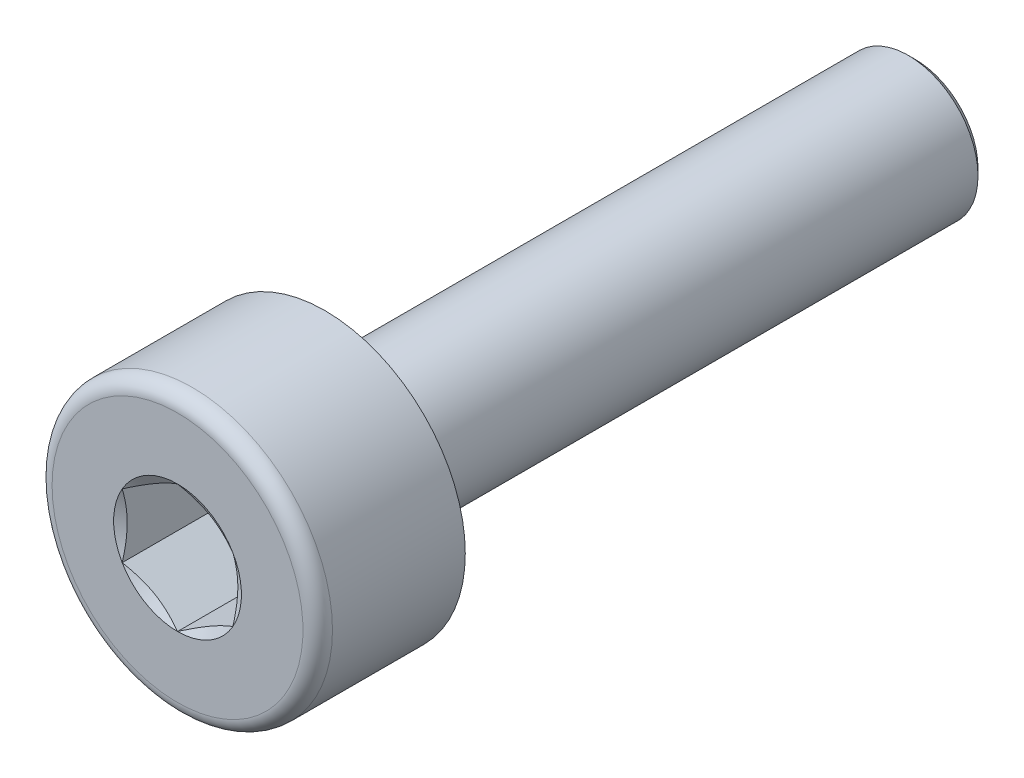
ISO-10303-21;
HEADER;
FILE_DESCRIPTION(('STEP AP214'),'2;1');
FILE_NAME('part.step','',(''),(''),'','','');
FILE_SCHEMA(('AUTOMOTIVE_DESIGN { 1 0 10303 214 1 1 1 1 }'));
ENDSEC;
DATA;
#1=APPLICATION_CONTEXT('core data for automotive mechanical design processes');
#2=APPLICATION_PROTOCOL_DEFINITION('international standard','automotive_design',2000,#1);
#3=PRODUCT_CONTEXT('',#1,'mechanical');
#4=PRODUCT('Part','Part','',(#3));
#5=PRODUCT_RELATED_PRODUCT_CATEGORY('part','',(#4));
#6=PRODUCT_DEFINITION_FORMATION('','',#4);
#7=PRODUCT_DEFINITION_CONTEXT('part definition',#1,'design');
#8=PRODUCT_DEFINITION('design','',#6,#7);
#9=PRODUCT_DEFINITION_SHAPE('','',#8);
#10=(LENGTH_UNIT() NAMED_UNIT(*) SI_UNIT(.MILLI.,.METRE.));
#11=(NAMED_UNIT(*) PLANE_ANGLE_UNIT() SI_UNIT($,.RADIAN.));
#12=(NAMED_UNIT(*) SI_UNIT($,.STERADIAN.) SOLID_ANGLE_UNIT());
#13=UNCERTAINTY_MEASURE_WITH_UNIT(LENGTH_MEASURE(1.E-05),#10,'distance_accuracy_value','');
#14=(GEOMETRIC_REPRESENTATION_CONTEXT(3) GLOBAL_UNCERTAINTY_ASSIGNED_CONTEXT((#13)) GLOBAL_UNIT_ASSIGNED_CONTEXT((#10,
#11,#12)) REPRESENTATION_CONTEXT('',''));
#15=CARTESIAN_POINT('',(0.,0.,0.));
#16=DIRECTION('',(0.,0.,1.));
#17=DIRECTION('',(1.,0.,0.));
#18=AXIS2_PLACEMENT_3D('',#15,#16,#17);
#19=CARTESIAN_POINT('',(0.,0.,-8.));
#20=DIRECTION('',(0.,0.,1.));
#21=DIRECTION('',(1.,0.,0.));
#22=AXIS2_PLACEMENT_3D('',#19,#20,#21);
#23=CONICAL_SURFACE('',#22,0.8487,0.785398162499998);
#24=CARTESIAN_POINT('',(0.,0.,-8.));
#25=DIRECTION('',(0.,0.,-1.));
#26=DIRECTION('',(1.,0.,0.));
#27=AXIS2_PLACEMENT_3D('',#24,#25,#26);
#28=CIRCLE('',#27,0.8487);
#29=CARTESIAN_POINT('',(0.8487,0.,-8.));
#30=VERTEX_POINT('',#29);
#31=EDGE_CURVE('E370',#30,#30,#28,.T.);
#32=ORIENTED_EDGE('',*,*,#31,.F.);
#33=EDGE_LOOP('',(#32));
#34=FACE_BOUND('',#33,.T.);
#35=CARTESIAN_POINT('',(0.,0.,-7.9057));
#36=DIRECTION('',(0.,0.,1.));
#37=DIRECTION('',(1.,0.,0.));
#38=AXIS2_PLACEMENT_3D('',#35,#36,#37);
#39=CIRCLE('',#38,0.943);
#40=CARTESIAN_POINT('',(0.943,0.,-7.9057));
#41=VERTEX_POINT('',#40);
#42=EDGE_CURVE('E364',#41,#41,#39,.T.);
#43=ORIENTED_EDGE('',*,*,#42,.F.);
#44=EDGE_LOOP('',(#43));
#45=FACE_BOUND('',#44,.T.);
#46=ADVANCED_FACE('F16',(#34,#45),#23,.T.);
#47=CARTESIAN_POINT('',(0.,0.,-0.100000000000005));
#48=DIRECTION('',(0.,0.,1.));
#49=DIRECTION('',(1.,0.,0.));
#50=AXIS2_PLACEMENT_3D('',#47,#48,#49);
#51=TOROIDAL_SURFACE('',#50,1.043,0.1);
#52=CARTESIAN_POINT('',(0.,0.,-0.100000000000005));
#53=DIRECTION('',(0.,0.,-1.));
#54=DIRECTION('',(1.,0.,0.));
#55=AXIS2_PLACEMENT_3D('',#52,#53,#54);
#56=CIRCLE('',#55,0.943);
#57=CARTESIAN_POINT('',(0.943,0.,-0.100000000000005));
#58=VERTEX_POINT('',#57);
#59=EDGE_CURVE('E374',#58,#58,#56,.T.);
#60=ORIENTED_EDGE('',*,*,#59,.F.);
#61=EDGE_LOOP('',(#60));
#62=FACE_BOUND('',#61,.T.);
#63=CARTESIAN_POINT('',(0.,0.,0.));
#64=DIRECTION('',(0.,0.,1.));
#65=DIRECTION('',(1.,0.,0.));
#66=AXIS2_PLACEMENT_3D('',#63,#64,#65);
#67=CIRCLE('',#66,1.043);
#68=CARTESIAN_POINT('',(1.043,0.,0.));
#69=VERTEX_POINT('',#68);
#70=EDGE_CURVE('E369',#69,#69,#67,.T.);
#71=ORIENTED_EDGE('',*,*,#70,.F.);
#72=EDGE_LOOP('',(#71));
#73=FACE_BOUND('',#72,.T.);
#74=ADVANCED_FACE('F460',(#62,#73),#51,.F.);
#75=CARTESIAN_POINT('',(0.,0.,1.8));
#76=DIRECTION('',(0.,0.,-1.));
#77=DIRECTION('',(-1.,0.,0.));
#78=AXIS2_PLACEMENT_3D('',#75,#76,#77);
#79=TOROIDAL_SURFACE('',#78,1.7,0.2);
#80=CARTESIAN_POINT('',(0.,0.,1.8));
#81=DIRECTION('',(0.,0.,-1.));
#82=DIRECTION('',(-1.,0.,0.));
#83=AXIS2_PLACEMENT_3D('',#80,#81,#82);
#84=CIRCLE('',#83,1.9);
#85=CARTESIAN_POINT('',(-1.9,0.,1.8));
#86=VERTEX_POINT('',#85);
#87=EDGE_CURVE('E373',#86,#86,#84,.T.);
#88=ORIENTED_EDGE('',*,*,#87,.F.);
#89=EDGE_LOOP('',(#88));
#90=FACE_BOUND('',#89,.T.);
#91=CARTESIAN_POINT('',(0.,0.,2.));
#92=DIRECTION('',(0.,0.,1.));
#93=DIRECTION('',(-1.,0.,0.));
#94=AXIS2_PLACEMENT_3D('',#91,#92,#93);
#95=CIRCLE('',#94,1.7);
#96=CARTESIAN_POINT('',(-1.7,0.,2.));
#97=VERTEX_POINT('',#96);
#98=EDGE_CURVE('E137',#97,#97,#95,.T.);
#99=ORIENTED_EDGE('',*,*,#98,.F.);
#100=EDGE_LOOP('',(#99));
#101=FACE_BOUND('',#100,.T.);
#102=ADVANCED_FACE('F146',(#90,#101),#79,.T.);
#103=CARTESIAN_POINT('',(0.,0.,1.11698729810778));
#104=DIRECTION('',(0.,0.,1.));
#105=DIRECTION('',(1.,0.,0.));
#106=AXIS2_PLACEMENT_3D('',#103,#104,#105);
#107=CONICAL_SURFACE('',#106,1.73205080278248,1.04719755);
#108=CARTESIAN_POINT('',(0.,0.,0.11698729810778));
#109=VERTEX_POINT('',#108);
#110=VERTEX_LOOP('',#109);
#111=FACE_BOUND('',#110,.T.);
#112=CARTESIAN_POINT('',(0.,0.,0.55));
#113=DIRECTION('',(0.,0.,-1.));
#114=DIRECTION('',(-1.,0.,0.));
#115=AXIS2_PLACEMENT_3D('',#112,#113,#114);
#116=CIRCLE('',#115,0.75);
#117=CARTESIAN_POINT('',(-0.75,0.,0.55));
#118=VERTEX_POINT('',#117);
#119=CARTESIAN_POINT('',(-0.375,0.649519052838328,0.55));
#120=VERTEX_POINT('',#119);
#121=EDGE_CURVE('E152',#118,#120,#116,.T.);
#122=ORIENTED_EDGE('',*,*,#121,.F.);
#123=CARTESIAN_POINT('',(0.,0.,0.55));
#124=DIRECTION('',(0.,0.,1.));
#125=DIRECTION('',(1.,0.,0.));
#126=AXIS2_PLACEMENT_3D('',#123,#124,#125);
#127=CIRCLE('',#126,0.75);
#128=CARTESIAN_POINT('',(-0.375,-0.649519052838331,0.55));
#129=VERTEX_POINT('',#128);
#130=EDGE_CURVE('E156',#118,#129,#127,.T.);
#131=ORIENTED_EDGE('',*,*,#130,.T.);
#132=CARTESIAN_POINT('',(0.,0.,0.55));
#133=DIRECTION('',(0.,0.,1.));
#134=DIRECTION('',(1.,0.,0.));
#135=AXIS2_PLACEMENT_3D('',#132,#133,#134);
#136=CIRCLE('',#135,0.75);
#137=CARTESIAN_POINT('',(0.375,-0.649519052838328,0.55));
#138=VERTEX_POINT('',#137);
#139=EDGE_CURVE('E407',#129,#138,#136,.T.);
#140=ORIENTED_EDGE('',*,*,#139,.T.);
#141=CARTESIAN_POINT('',(0.,0.,0.55));
#142=DIRECTION('',(0.,0.,1.));
#143=DIRECTION('',(1.,0.,0.));
#144=AXIS2_PLACEMENT_3D('',#141,#142,#143);
#145=CIRCLE('',#144,0.75);
#146=CARTESIAN_POINT('',(0.75,0.,0.55));
#147=VERTEX_POINT('',#146);
#148=EDGE_CURVE('E401',#138,#147,#145,.T.);
#149=ORIENTED_EDGE('',*,*,#148,.T.);
#150=CARTESIAN_POINT('',(0.,0.,0.55));
#151=DIRECTION('',(0.,0.,1.));
#152=DIRECTION('',(1.,0.,0.));
#153=AXIS2_PLACEMENT_3D('',#150,#151,#152);
#154=CIRCLE('',#153,0.75);
#155=CARTESIAN_POINT('',(0.375,0.64951905283833,0.55));
#156=VERTEX_POINT('',#155);
#157=EDGE_CURVE('E390',#147,#156,#154,.T.);
#158=ORIENTED_EDGE('',*,*,#157,.T.);
#159=CARTESIAN_POINT('',(0.,0.,0.55));
#160=DIRECTION('',(0.,0.,1.));
#161=DIRECTION('',(1.,0.,0.));
#162=AXIS2_PLACEMENT_3D('',#159,#160,#161);
#163=CIRCLE('',#162,0.75);
#164=EDGE_CURVE('E160',#156,#120,#163,.T.);
#165=ORIENTED_EDGE('',*,*,#164,.T.);
#166=EDGE_LOOP('',(#122,#131,#140,#149,#158,#165));
#167=FACE_BOUND('',#166,.T.);
#168=ADVANCED_FACE('F142',(#111,#167),#107,.F.);
#169=CARTESIAN_POINT('',(0.75,0.433012701892221,2.));
#170=DIRECTION('',(-0.5,-0.86602540378444,0.));
#171=DIRECTION('',(-0.86602540378444,0.5,0.));
#172=AXIS2_PLACEMENT_3D('',#169,#170,#171);
#173=PLANE('',#172);
#174=DIRECTION('',(-0.86602540378444,0.5,0.));
#175=VECTOR('',#174,1.);
#176=CARTESIAN_POINT('',(0.75,0.433012701892221,0.55));
#177=LINE('',#176,#175);
#178=CARTESIAN_POINT('',(0.,0.866025403784437,0.55));
#179=VERTEX_POINT('',#178);
#180=EDGE_CURVE('E202',#156,#179,#177,.T.);
#181=ORIENTED_EDGE('',*,*,#180,.F.);
#182=DIRECTION('',(-0.86602540378444,0.5,0.));
#183=VECTOR('',#182,1.);
#184=CARTESIAN_POINT('',(0.75,0.433012701892221,0.55));
#185=LINE('',#184,#183);
#186=CARTESIAN_POINT('',(0.75,0.433012701892221,0.55));
#187=VERTEX_POINT('',#186);
#188=EDGE_CURVE('E397',#187,#156,#185,.T.);
#189=ORIENTED_EDGE('',*,*,#188,.F.);
#190=DIRECTION('',(0.,0.,-1.));
#191=VECTOR('',#190,1.);
#192=CARTESIAN_POINT('',(0.75,0.433012701892221,2.));
#193=LINE('',#192,#191);
#194=CARTESIAN_POINT('',(0.75,0.433012701892224,2.));
#195=VERTEX_POINT('',#194);
#196=EDGE_CURVE('E409',#195,#187,#193,.T.);
#197=ORIENTED_EDGE('',*,*,#196,.F.);
#198=CARTESIAN_POINT('',(0.,0.866025403704285,2.00000000013883));
#199=CARTESIAN_POINT('',(0.0156892599229702,0.856965839222739,1.9947698155842));
#200=CARTESIAN_POINT('',(0.0314402780607131,0.847877550176279,1.9897684510463));
#201=CARTESIAN_POINT('',(0.062697745339752,0.829853455311486,1.98039359126284));
#202=CARTESIAN_POINT('',(0.0782014200281446,0.820918987302059,1.9760082453587));
#203=CARTESIAN_POINT('',(0.109037927490052,0.803157156080633,1.96786353249991));
#204=CARTESIAN_POINT('',(0.124368700286047,0.794330821787135,1.96409418536437));
#205=CARTESIAN_POINT('',(0.154939726616243,0.776730864036825,1.95718173668814));
#206=CARTESIAN_POINT('',(0.170178757913405,0.767957936883978,1.95403147248059));
#207=CARTESIAN_POINT('',(0.201384289874248,0.749948562247064,1.9482062448593));
#208=CARTESIAN_POINT('',(0.217353692330928,0.740708505674273,1.94555780133669));
#209=CARTESIAN_POINT('',(0.249051462957125,0.722356552510861,1.94102609281645));
#210=CARTESIAN_POINT('',(0.264778416313142,0.71324569624673,1.93912884039682));
#211=CARTESIAN_POINT('',(0.296154479185825,0.695090788336297,1.93609633812568));
#212=CARTESIAN_POINT('',(0.311803014528512,0.686046873847058,1.93495438078998));
#213=CARTESIAN_POINT('',(0.343172066603156,0.667925624967159,1.93342224301015));
#214=CARTESIAN_POINT('',(0.358892664599246,0.65884826496983,1.93303403309925));
#215=CARTESIAN_POINT('',(0.390326427533092,0.640670540467131,1.93300645357687));
#216=CARTESIAN_POINT('',(0.406039589736461,0.631570170907838,1.93336726594993));
#217=CARTESIAN_POINT('',(0.437420245572584,0.613423458687889,1.93485575270786));
#218=CARTESIAN_POINT('',(0.453087768722289,0.604377045536551,1.93598194094562));
#219=CARTESIAN_POINT('',(0.484538614195373,0.586248551380507,1.93899091818633));
#220=CARTESIAN_POINT('',(0.500321532254113,0.577167015031413,1.94088114384089));
#221=CARTESIAN_POINT('',(0.532141557341243,0.558852225601889,1.94540692117773));
#222=CARTESIAN_POINT('',(0.548177012090531,0.54961980827947,1.94805733982057));
#223=CARTESIAN_POINT('',(0.579448282289125,0.531572351904331,1.95388772601825));
#224=CARTESIAN_POINT('',(0.594688804750864,0.522756454471621,1.95703998588519));
#225=CARTESIAN_POINT('',(0.625278981332695,0.505065392493337,1.96396292697153));
#226=CARTESIAN_POINT('',(0.640627339010675,0.496191029888561,1.96774136848581));
#227=CARTESIAN_POINT('',(0.671521426057348,0.47833496209781,1.97591025964495));
#228=CARTESIAN_POINT('',(0.687065104471307,0.469354575983387,1.98031127969053));
#229=CARTESIAN_POINT('',(0.71842697170541,0.45124072898661,1.98972369406521));
#230=CARTESIAN_POINT('',(0.734242433883201,0.442108980139515,1.99474749870308));
#231=CARTESIAN_POINT('',(0.749999999930582,0.433012701852146,2.00000000013883));
#232=B_SPLINE_CURVE_WITH_KNOTS('',3,(#198,#199,#200,#201,#202,#203,#204,#205,#206,#207,#208,
#209,#210,#211,#212,#213,#214,#215,#216,#217,#218,#219,#220,#221,#222,#223,#224,#225,#226,#227,
#228,#229,#230,#231),.UNSPECIFIED.,.F.,.F.,(4,2,2,2,2,2,2,2,2,2,2,2,2,2,2,2,4),(0.,
0.056571760789199,0.111834480744552,0.166086679408165,0.219668512942499,0.275572800676588,
0.330380743138964,0.384695177782462,0.439151417284494,0.493620889174478,0.547984897538614,
0.602891306510916,0.658954766503855,0.712604799624661,0.766977710694813,0.822419446245689,
0.879233286374633),.UNSPECIFIED.);
#233=CARTESIAN_POINT('',(0.,0.866025403784441,2.));
#234=VERTEX_POINT('',#233);
#235=EDGE_CURVE('E209',#234,#195,#232,.T.);
#236=ORIENTED_EDGE('',*,*,#235,.F.);
#237=DIRECTION('',(0.,0.,-1.));
#238=VECTOR('',#237,1.);
#239=CARTESIAN_POINT('',(0.,0.866025403784437,2.));
#240=LINE('',#239,#238);
#241=EDGE_CURVE('E11',#234,#179,#240,.T.);
#242=ORIENTED_EDGE('',*,*,#241,.T.);
#243=EDGE_LOOP('',(#181,#189,#197,#236,#242));
#244=FACE_BOUND('',#243,.T.);
#245=ADVANCED_FACE('F145',(#244),#173,.T.);
#246=CARTESIAN_POINT('',(0.,0.866025403784437,2.));
#247=DIRECTION('',(0.5,-0.866025403784438,0.));
#248=DIRECTION('',(0.,0.,-1.));
#249=AXIS2_PLACEMENT_3D('',#246,#247,#248);
#250=PLANE('',#249);
#251=DIRECTION('',(-0.866025403784438,-0.5,0.));
#252=VECTOR('',#251,1.);
#253=CARTESIAN_POINT('',(0.,0.866025403784437,0.55));
#254=LINE('',#253,#252);
#255=CARTESIAN_POINT('',(-0.75,0.433012701892217,0.55));
#256=VERTEX_POINT('',#255);
#257=EDGE_CURVE('E165',#120,#256,#254,.T.);
#258=ORIENTED_EDGE('',*,*,#257,.F.);
#259=DIRECTION('',(-0.866025403784438,-0.5,0.));
#260=VECTOR('',#259,1.);
#261=CARTESIAN_POINT('',(0.,0.866025403784437,0.55));
#262=LINE('',#261,#260);
#263=EDGE_CURVE('E28',#179,#120,#262,.T.);
#264=ORIENTED_EDGE('',*,*,#263,.F.);
#265=ORIENTED_EDGE('',*,*,#241,.F.);
#266=CARTESIAN_POINT('',(-0.749999999930586,0.433012701852143,2.00000000013883));
#267=CARTESIAN_POINT('',(-0.734309556980735,0.442070217271308,1.99476981558416));
#268=CARTESIAN_POINT('',(-0.718563358720559,0.451166854590894,1.98976845104621));
#269=CARTESIAN_POINT('',(-0.687325301047725,0.469224567880172,1.98039359126269));
#270=CARTESIAN_POINT('',(-0.671835987438018,0.478183910007621,1.97600824535854));
#271=CARTESIAN_POINT('',(-0.641035536651571,0.496008193222882,1.96786353249975));
#272=CARTESIAN_POINT('',(-0.625726320533152,0.504871864777078,1.96409418536422));
#273=CARTESIAN_POINT('',(-0.59519879685093,0.522547171323563,1.95718173668804));
#274=CARTESIAN_POINT('',(-0.579981703422568,0.531358095979505,1.95403147248054));
#275=CARTESIAN_POINT('',(-0.54878236150066,0.549378192077654,1.94820624485936));
#276=CARTESIAN_POINT('',(-0.532795536548096,0.558588072001954,1.94555780133682));
#277=CARTESIAN_POINT('',(-0.501053393586713,0.576863170025825,1.94102609281666));
#278=CARTESIAN_POINT('',(-0.485299683933813,0.585927683024209,1.93912884039705));
#279=CARTESIAN_POINT('',(-0.453889041043679,0.604022696587519,1.93609633812591));
#280=CARTESIAN_POINT('',(-0.438232513674936,0.613052768481726,1.9349543807902));
#281=CARTESIAN_POINT('',(-0.406854525759029,0.631158540031098,1.93342224301028));
#282=CARTESIAN_POINT('',(-0.391133002403772,0.640234297259733,1.9330340330993));
#283=CARTESIAN_POINT('',(-0.359673749734693,0.658367872245307,1.93300645357681));
#284=CARTESIAN_POINT('',(-0.343936017411239,0.667425685107237,1.9333672659498));
#285=CARTESIAN_POINT('',(-0.312530175716122,0.685528774138386,1.93485575270765));
#286=CARTESIAN_POINT('',(-0.296861990539261,0.694574040624693,1.9359819409454));
#287=CARTESIAN_POINT('',(-0.265436831331294,0.712747024696949,1.93899091818611));
#288=CARTESIAN_POINT('',(-0.249680531118105,0.721874664507256,1.9408811438407));
#289=CARTESIAN_POINT('',(-0.217909445663029,0.740274219867395,1.94540692117761));
#290=CARTESIAN_POINT('',(-0.201896210348363,0.749545122380553,1.9480573398205));
#291=CARTESIAN_POINT('',(-0.170631019554154,0.767603108593688,1.9538877260182));
#292=CARTESIAN_POINT('',(-0.155375967189516,0.776393839496018,1.95703998588508));
#293=CARTESIAN_POINT('',(-0.124759969805658,0.794040178532845,1.96396292697134));
#294=CARTESIAN_POINT('',(-0.109400367508598,0.802895064885937,1.96774136848561));
#295=CARTESIAN_POINT('',(-0.0784895156667996,0.820722095199734,1.97591025964475));
#296=CARTESIAN_POINT('',(-0.0629404339489026,0.829693122517313,1.98031127969035));
#297=CARTESIAN_POINT('',(-0.0315724486721972,0.847796372753922,1.9897236940651));
#298=CARTESIAN_POINT('',(-0.0157563911005923,0.856927090349035,1.99474749870303));
#299=CARTESIAN_POINT('',(0.,0.866025403704285,2.00000000013883));
#300=B_SPLINE_CURVE_WITH_KNOTS('',3,(#266,#267,#268,#269,#270,#271,#272,#273,#274,#275,#276,
#277,#278,#279,#280,#281,#282,#283,#284,#285,#286,#287,#288,#289,#290,#291,#292,#293,#294,#295,
#296,#297,#298,#299),.UNSPECIFIED.,.F.,.F.,(4,2,2,2,2,2,2,2,2,2,2,2,2,2,2,2,4),(0.,
0.0565717607896603,0.111834480745151,0.166086679408604,0.219668512942505,0.275572800675936,
0.330380743138122,0.384695177781853,0.439151417284488,0.493620889172925,0.547984897536516,
0.602891306509322,0.658954766503856,0.712604799624143,0.766977710694102,0.822419446245145,
0.879233286374645),.UNSPECIFIED.);
#301=CARTESIAN_POINT('',(-0.75,0.433012701892217,2.));
#302=VERTEX_POINT('',#301);
#303=EDGE_CURVE('E435',#302,#234,#300,.T.);
#304=ORIENTED_EDGE('',*,*,#303,.F.);
#305=DIRECTION('',(0.,0.,-1.));
#306=VECTOR('',#305,1.);
#307=CARTESIAN_POINT('',(-0.75,0.433012701892217,2.));
#308=LINE('',#307,#306);
#309=EDGE_CURVE('E199',#302,#256,#308,.T.);
#310=ORIENTED_EDGE('',*,*,#309,.T.);
#311=EDGE_LOOP('',(#258,#264,#265,#304,#310));
#312=FACE_BOUND('',#311,.T.);
#313=ADVANCED_FACE('F322',(#312),#250,.T.);
#314=CARTESIAN_POINT('',(-0.75,1.29903810567665,0.55));
#315=DIRECTION('',(0.,0.,1.));
#316=DIRECTION('',(1.,0.,0.));
#317=AXIS2_PLACEMENT_3D('',#314,#315,#316);
#318=PLANE('',#317);
#319=ORIENTED_EDGE('',*,*,#164,.F.);
#320=ORIENTED_EDGE('',*,*,#180,.T.);
#321=ORIENTED_EDGE('',*,*,#263,.T.);
#322=EDGE_LOOP('',(#319,#320,#321));
#323=FACE_BOUND('',#322,.T.);
#324=ADVANCED_FACE('F319',(#323),#318,.T.);
#325=CARTESIAN_POINT('',(-0.75,0.433012701892217,2.));
#326=DIRECTION('',(1.,0.,0.));
#327=DIRECTION('',(0.,1.,0.));
#328=AXIS2_PLACEMENT_3D('',#325,#326,#327);
#329=PLANE('',#328);
#330=DIRECTION('',(0.,-1.,0.));
#331=VECTOR('',#330,1.);
#332=CARTESIAN_POINT('',(-0.75,0.433012701892217,0.55));
#333=LINE('',#332,#331);
#334=CARTESIAN_POINT('',(-0.75,-0.433012701892222,0.55));
#335=VERTEX_POINT('',#334);
#336=EDGE_CURVE('E171',#118,#335,#333,.T.);
#337=ORIENTED_EDGE('',*,*,#336,.F.);
#338=DIRECTION('',(0.,-1.,0.));
#339=VECTOR('',#338,1.);
#340=CARTESIAN_POINT('',(-0.75,0.433012701892217,0.55));
#341=LINE('',#340,#339);
#342=EDGE_CURVE('E173',#256,#118,#341,.T.);
#343=ORIENTED_EDGE('',*,*,#342,.F.);
#344=ORIENTED_EDGE('',*,*,#309,.F.);
#345=CARTESIAN_POINT('',(-0.749999999930583,-0.433012701852145,2.00000000013883));
#346=CARTESIAN_POINT('',(-0.750000248836865,-0.414076842421449,1.99453488708879));
#347=CARTESIAN_POINT('',(-0.7499637578932,-0.395072396701923,1.98929836137765));
#348=CARTESIAN_POINT('',(-0.749861139358207,-0.357570661083845,1.97954046500373));
#349=CARTESIAN_POINT('',(-0.749796061923913,-0.339078105034063,1.97500082883245));
#350=CARTESIAN_POINT('',(-0.749676272550339,-0.302493510363754,1.96663447948474));
#351=CARTESIAN_POINT('',(-0.749621315318651,-0.284405350353695,1.962790948726));
#352=CARTESIAN_POINT('',(-0.74954987861208,-0.24851030445393,1.95581546279788));
#353=CARTESIAN_POINT('',(-0.749532567813935,-0.230706149953731,1.95266954186269));
#354=CARTESIAN_POINT('',(-0.74954844475652,-0.195246314650841,1.94708585492333));
#355=CARTESIAN_POINT('',(-0.749580916870242,-0.177592130139322,1.94463864224451));
#356=CARTESIAN_POINT('',(-0.74968809904746,-0.142287594626062,1.94044715641652));
#357=CARTESIAN_POINT('',(-0.749762602356001,-0.124637644788344,1.93869951342814));
#358=CARTESIAN_POINT('',(-0.749923577221635,-0.0891867869652363,1.93590125578368));
#359=CARTESIAN_POINT('',(-0.750010111181125,-0.071385578288269,1.93485445260288));
#360=CARTESIAN_POINT('',(-0.750132905402375,-0.0354701821928222,1.93344794126472));
#361=CARTESIAN_POINT('',(-0.750168336872213,-0.0173555551913137,1.93309952531239));
#362=CARTESIAN_POINT('',(-0.750118644926738,0.0187266395222066,1.93309192500439));
#363=CARTESIAN_POINT('',(-0.750034498376782,0.0366942066157063,1.93342716537521));
#364=CARTESIAN_POINT('',(-0.749844927545387,0.0723373049307664,1.93481360250678));
#365=CARTESIAN_POINT('',(-0.749739834464745,0.0900132441301548,1.93585419508808));
#366=CARTESIAN_POINT('',(-0.749557969521019,0.125236629210811,1.9386411657401));
#367=CARTESIAN_POINT('',(-0.749481083490041,0.142784304890677,1.94038463734484));
#368=CARTESIAN_POINT('',(-0.749382054750788,0.177908451198646,1.94457007688137));
#369=CARTESIAN_POINT('',(-0.749360261164367,0.195484402661483,1.94701639055832));
#370=CARTESIAN_POINT('',(-0.749372749946694,0.230812952937227,1.95260019425251));
#371=CARTESIAN_POINT('',(-0.749407932557229,0.248563895974585,1.95574808927239));
#372=CARTESIAN_POINT('',(-0.749517078894373,0.284378647292353,1.96272959677463));
#373=CARTESIAN_POINT('',(-0.749591966474484,0.302439543044394,1.96657804567665));
#374=CARTESIAN_POINT('',(-0.749748208770055,0.338996617778967,1.97495634487556));
#375=CARTESIAN_POINT('',(-0.749829692506719,0.357488740130576,1.9795037444558));
#376=CARTESIAN_POINT('',(-0.749956547300484,0.395017314569322,1.98927965514299));
#377=CARTESIAN_POINT('',(-0.750000485346331,0.414048876713593,1.99452702107214));
#378=CARTESIAN_POINT('',(-0.749999999930586,0.433012701852143,2.00000000013883));
#379=B_SPLINE_CURVE_WITH_KNOTS('',3,(#345,#346,#347,#348,#349,#350,#351,#352,#353,#354,#355,
#356,#357,#358,#359,#360,#361,#362,#363,#364,#365,#366,#367,#368,#369,#370,#371,#372,#373,#374,
#375,#376,#377,#378),.UNSPECIFIED.,.F.,.F.,(4,2,2,2,2,2,2,2,2,2,2,2,2,2,2,2,4),(0.,
0.0591284413537299,0.116245912820036,0.171711972049831,0.225940215976258,0.279396208440325,
0.332591510953851,0.386073812562082,0.440414109631212,0.494313029497268,0.547419102172759,
0.60030779286108,0.653530809409725,0.707603001157793,0.762992425360693,0.820114495854659,
0.879330131981602),.UNSPECIFIED.);
#380=CARTESIAN_POINT('',(-0.75,-0.433012701892222,2.));
#381=VERTEX_POINT('',#380);
#382=EDGE_CURVE('E305',#381,#302,#379,.T.);
#383=ORIENTED_EDGE('',*,*,#382,.F.);
#384=DIRECTION('',(0.,0.,-1.));
#385=VECTOR('',#384,1.);
#386=CARTESIAN_POINT('',(-0.75,-0.433012701892222,2.));
#387=LINE('',#386,#385);
#388=EDGE_CURVE('E166',#381,#335,#387,.T.);
#389=ORIENTED_EDGE('',*,*,#388,.T.);
#390=EDGE_LOOP('',(#337,#343,#344,#383,#389));
#391=FACE_BOUND('',#390,.T.);
#392=ADVANCED_FACE('F172',(#391),#329,.T.);
#393=CARTESIAN_POINT('',(-0.75,1.29903810567665,0.55));
#394=DIRECTION('',(0.,0.,1.));
#395=DIRECTION('',(1.,0.,0.));
#396=AXIS2_PLACEMENT_3D('',#393,#394,#395);
#397=PLANE('',#396);
#398=ORIENTED_EDGE('',*,*,#121,.T.);
#399=ORIENTED_EDGE('',*,*,#257,.T.);
#400=ORIENTED_EDGE('',*,*,#342,.T.);
#401=EDGE_LOOP('',(#398,#399,#400));
#402=FACE_BOUND('',#401,.T.);
#403=ADVANCED_FACE('F236',(#402),#397,.T.);
#404=CARTESIAN_POINT('',(-0.75,-0.433012701892222,2.));
#405=DIRECTION('',(0.5,0.866025403784441,0.));
#406=DIRECTION('',(0.,0.,-1.));
#407=AXIS2_PLACEMENT_3D('',#404,#405,#406);
#408=PLANE('',#407);
#409=DIRECTION('',(0.866025403784441,-0.5,0.));
#410=VECTOR('',#409,1.);
#411=CARTESIAN_POINT('',(-0.75,-0.433012701892222,0.55));
#412=LINE('',#411,#410);
#413=CARTESIAN_POINT('',(0.,-0.866025403784437,0.55));
#414=VERTEX_POINT('',#413);
#415=EDGE_CURVE('E190',#129,#414,#412,.T.);
#416=ORIENTED_EDGE('',*,*,#415,.F.);
#417=DIRECTION('',(0.866025403784441,-0.5,0.));
#418=VECTOR('',#417,1.);
#419=CARTESIAN_POINT('',(-0.75,-0.433012701892222,0.55));
#420=LINE('',#419,#418);
#421=EDGE_CURVE('E178',#335,#129,#420,.T.);
#422=ORIENTED_EDGE('',*,*,#421,.F.);
#423=ORIENTED_EDGE('',*,*,#388,.F.);
#424=CARTESIAN_POINT('',(0.,-0.866025403704285,2.00000000013883));
#425=CARTESIAN_POINT('',(-0.0156892599228464,-0.856965839222813,1.99476981558425));
#426=CARTESIAN_POINT('',(-0.0314402780604691,-0.847877550176437,1.98976845104639));
#427=CARTESIAN_POINT('',(-0.0626977453393591,-0.829853455311766,1.98039359126299));
#428=CARTESIAN_POINT('',(-0.0782014200277238,-0.820918987302377,1.97600824535886));
#429=CARTESIAN_POINT('',(-0.109037927489653,-0.803157156080972,1.96786353250007));
#430=CARTESIAN_POINT('',(-0.124368700285698,-0.794330821787456,1.96409418536452));
#431=CARTESIAN_POINT('',(-0.154939726616042,-0.776730864037026,1.95718173668823));
#432=CARTESIAN_POINT('',(-0.170178757913303,-0.767957936884077,1.95403147248063));
#433=CARTESIAN_POINT('',(-0.201384289874004,-0.749948562247164,1.94820624485932));
#434=CARTESIAN_POINT('',(-0.217353692330441,-0.740708505674479,1.94555780133673));
#435=CARTESIAN_POINT('',(-0.249051462956336,-0.722356552511239,1.94102609281651));
#436=CARTESIAN_POINT('',(-0.264778416312295,-0.713245696247173,1.93912884039689));
#437=CARTESIAN_POINT('',(-0.29615447918501,-0.695090788336786,1.93609633812576));
#438=CARTESIAN_POINT('',(-0.311803014527789,-0.686046873847527,1.93495438079005));
#439=CARTESIAN_POINT('',(-0.343172066602735,-0.667925624967459,1.93342224301019));
#440=CARTESIAN_POINT('',(-0.358892664599036,-0.65884826496998,1.93303403309926));
#441=CARTESIAN_POINT('',(-0.390326427532835,-0.640670540467253,1.93300645357685));
#442=CARTESIAN_POINT('',(-0.406039589735947,-0.631570170908083,1.93336726594989));
#443=CARTESIAN_POINT('',(-0.437420245571745,-0.613423458688335,1.93485575270779));
#444=CARTESIAN_POINT('',(-0.453087768721382,-0.604377045537074,1.93598194094555));
#445=CARTESIAN_POINT('',(-0.484538614194493,-0.586248551381086,1.93899091818626));
#446=CARTESIAN_POINT('',(-0.500321532253326,-0.57716701503197,1.94088114384083));
#447=CARTESIAN_POINT('',(-0.532141557340784,-0.558852225602247,1.94540692117769));
#448=CARTESIAN_POINT('',(-0.548177012090305,-0.549619808279651,1.94805733982055));
#449=CARTESIAN_POINT('',(-0.579448282288962,-0.531572351904375,1.9538877260182));
#450=CARTESIAN_POINT('',(-0.594688804750536,-0.522756454471706,1.95703998588508));
#451=CARTESIAN_POINT('',(-0.625278981332154,-0.505065392493504,1.96396292697134));
#452=CARTESIAN_POINT('',(-0.640627339010086,-0.49619102988877,1.96774136848561));
#453=CARTESIAN_POINT('',(-0.671521426056767,-0.478334962098053,1.97591025964476));
#454=CARTESIAN_POINT('',(-0.687065104470782,-0.469354575983625,1.98031127969035));
#455=CARTESIAN_POINT('',(-0.718426971705101,-0.451240728986769,1.98972369406511));
#456=CARTESIAN_POINT('',(-0.73424243388305,-0.4421089801396,1.99474749870303));
#457=CARTESIAN_POINT('',(-0.749999999930583,-0.433012701852145,2.00000000013883));
#458=B_SPLINE_CURVE_WITH_KNOTS('',3,(#424,#425,#426,#427,#428,#429,#430,#431,#432,#433,#434,
#435,#436,#437,#438,#439,#440,#441,#442,#443,#444,#445,#446,#447,#448,#449,#450,#451,#452,#453,
#454,#455,#456,#457),.UNSPECIFIED.,.F.,.F.,(4,2,2,2,2,2,2,2,2,2,2,2,2,2,2,2,4),(0.,
0.0565717607887411,0.111834480743957,0.16608667940773,0.219668512942494,0.275572800675795,
0.330380743137918,0.384695177781684,0.43915141728449,0.493620889173621,0.547984897537462,
0.602891306510045,0.658954766503851,0.712604799624143,0.766977710694103,0.822419446245142,
0.879233286374632),.UNSPECIFIED.);
#459=CARTESIAN_POINT('',(0.,-0.866025403784441,2.));
#460=VERTEX_POINT('',#459);
#461=EDGE_CURVE('E528',#460,#381,#458,.T.);
#462=ORIENTED_EDGE('',*,*,#461,.F.);
#463=DIRECTION('',(0.,0.,-1.));
#464=VECTOR('',#463,1.);
#465=CARTESIAN_POINT('',(0.,-0.866025403784437,2.));
#466=LINE('',#465,#464);
#467=EDGE_CURVE('E182',#460,#414,#466,.T.);
#468=ORIENTED_EDGE('',*,*,#467,.T.);
#469=EDGE_LOOP('',(#416,#422,#423,#462,#468));
#470=FACE_BOUND('',#469,.T.);
#471=ADVANCED_FACE('F232',(#470),#408,.T.);
#472=CARTESIAN_POINT('',(-0.75,1.29903810567665,0.55));
#473=DIRECTION('',(0.,0.,1.));
#474=DIRECTION('',(1.,0.,0.));
#475=AXIS2_PLACEMENT_3D('',#472,#473,#474);
#476=PLANE('',#475);
#477=ORIENTED_EDGE('',*,*,#130,.F.);
#478=ORIENTED_EDGE('',*,*,#336,.T.);
#479=ORIENTED_EDGE('',*,*,#421,.T.);
#480=EDGE_LOOP('',(#477,#478,#479));
#481=FACE_BOUND('',#480,.T.);
#482=ADVANCED_FACE('F180',(#481),#476,.T.);
#483=CARTESIAN_POINT('',(0.,-0.866025403784437,2.));
#484=DIRECTION('',(-0.5,0.866025403784439,0.));
#485=DIRECTION('',(0.,0.,1.));
#486=AXIS2_PLACEMENT_3D('',#483,#484,#485);
#487=PLANE('',#486);
#488=DIRECTION('',(0.866025403784439,0.5,0.));
#489=VECTOR('',#488,1.);
#490=CARTESIAN_POINT('',(0.,-0.866025403784437,0.55));
#491=LINE('',#490,#489);
#492=CARTESIAN_POINT('',(0.75,-0.433012701892219,0.55));
#493=VERTEX_POINT('',#492);
#494=EDGE_CURVE('E386',#138,#493,#491,.T.);
#495=ORIENTED_EDGE('',*,*,#494,.F.);
#496=DIRECTION('',(0.866025403784439,0.5,0.));
#497=VECTOR('',#496,1.);
#498=CARTESIAN_POINT('',(0.,-0.866025403784437,0.55));
#499=LINE('',#498,#497);
#500=EDGE_CURVE('E187',#414,#138,#499,.T.);
#501=ORIENTED_EDGE('',*,*,#500,.F.);
#502=ORIENTED_EDGE('',*,*,#467,.F.);
#503=CARTESIAN_POINT('',(0.749999999930581,-0.433012701852148,2.00000000013883));
#504=CARTESIAN_POINT('',(0.734309556980984,-0.442070217271168,1.99476981558424));
#505=CARTESIAN_POINT('',(0.718563358721074,-0.451166854590632,1.98976845104639));
#506=CARTESIAN_POINT('',(0.687325301048603,-0.469224567879777,1.98039359126298));
#507=CARTESIAN_POINT('',(0.67183598743899,-0.478183910007217,1.97600824535886));
#508=CARTESIAN_POINT('',(0.641035536652557,-0.496008193222534,1.96786353250007));
#509=CARTESIAN_POINT('',(0.625726320534055,-0.504871864776797,1.96409418536452));
#510=CARTESIAN_POINT('',(0.595198796851478,-0.522547171323424,1.95718173668823));
#511=CARTESIAN_POINT('',(0.579981703422844,-0.531358095979444,1.95403147248063));
#512=CARTESIAN_POINT('',(0.548782361500603,-0.549378192077588,1.94820624485931));
#513=CARTESIAN_POINT('',(0.532795536547979,-0.558588072001804,1.94555780133671));
#514=CARTESIAN_POINT('',(0.501053393586529,-0.576863170025569,1.94102609281648));
#515=CARTESIAN_POINT('',(0.48529968393362,-0.58592768302393,1.93912884039686));
#516=CARTESIAN_POINT('',(0.453889041043495,-0.604022696587234,1.93609633812572));
#517=CARTESIAN_POINT('',(0.438232513674769,-0.613052768481456,1.93495438079001));
#518=CARTESIAN_POINT('',(0.40685452575893,-0.631158540030935,1.93342224301017));
#519=CARTESIAN_POINT('',(0.391133002403725,-0.640234297259662,1.93303403309925));
#520=CARTESIAN_POINT('',(0.359673749734388,-0.658367872245584,1.93300645357686));
#521=CARTESIAN_POINT('',(0.343936017410624,-0.667425685107768,1.93336726594991));
#522=CARTESIAN_POINT('',(0.312530175715059,-0.685528774139212,1.93485575270783));
#523=CARTESIAN_POINT('',(0.29686199053806,-0.694574040625559,1.93598194094559));
#524=CARTESIAN_POINT('',(0.265436831330042,-0.712747024697748,1.9389909181863));
#525=CARTESIAN_POINT('',(0.249680531116938,-0.721874664507947,1.94088114384086));
#526=CARTESIAN_POINT('',(0.217909445662304,-0.740274219867778,1.94540692117771));
#527=CARTESIAN_POINT('',(0.201896210347996,-0.749545122380738,1.94805733982056));
#528=CARTESIAN_POINT('',(0.170631019554068,-0.767603108593762,1.95388772601823));
#529=CARTESIAN_POINT('',(0.155375967189356,-0.776393839496177,1.95703998588515));
#530=CARTESIAN_POINT('',(0.124759969805384,-0.794040178533101,1.96396292697146));
#531=CARTESIAN_POINT('',(0.109400367508284,-0.802895064886206,1.96774136848574));
#532=CARTESIAN_POINT('',(0.078489515666468,-0.820722095199985,1.97591025964488));
#533=CARTESIAN_POINT('',(0.0629404339485925,-0.829693122517535,1.98031127969046));
#534=CARTESIAN_POINT('',(0.0315724486720027,-0.847796372754047,1.98972369406517));
#535=CARTESIAN_POINT('',(0.0157563911004914,-0.856927090349094,1.99474749870306));
#536=CARTESIAN_POINT('',(0.,-0.866025403704285,2.00000000013883));
#537=B_SPLINE_CURVE_WITH_KNOTS('',3,(#503,#504,#505,#506,#507,#508,#509,#510,#511,#512,#513,
#514,#515,#516,#517,#518,#519,#520,#521,#522,#523,#524,#525,#526,#527,#528,#529,#530,#531,#532,
#533,#534,#535,#536),.UNSPECIFIED.,.F.,.F.,(4,2,2,2,2,2,2,2,2,2,2,2,2,2,2,2,4),(0.,
0.0565717607887445,0.111834480743961,0.166086679407735,0.219668512942498,0.275572800675981,
0.33038074313816,0.384695177781865,0.4391514172845,0.493620889174127,0.547984897538139,
0.602891306510557,0.658954766503858,0.712604799624481,0.766977710694566,0.822419446245501,
0.879233286374644),.UNSPECIFIED.);
#538=CARTESIAN_POINT('',(0.75,-0.433012701892224,2.));
#539=VERTEX_POINT('',#538);
#540=EDGE_CURVE('E266',#539,#460,#537,.T.);
#541=ORIENTED_EDGE('',*,*,#540,.F.);
#542=DIRECTION('',(0.,0.,-1.));
#543=VECTOR('',#542,1.);
#544=CARTESIAN_POINT('',(0.75,-0.433012701892219,2.));
#545=LINE('',#544,#543);
#546=EDGE_CURVE('E385',#539,#493,#545,.T.);
#547=ORIENTED_EDGE('',*,*,#546,.T.);
#548=EDGE_LOOP('',(#495,#501,#502,#541,#547));
#549=FACE_BOUND('',#548,.T.);
#550=ADVANCED_FACE('F231',(#549),#487,.T.);
#551=CARTESIAN_POINT('',(-0.75,1.29903810567665,0.55));
#552=DIRECTION('',(0.,0.,1.));
#553=DIRECTION('',(1.,0.,0.));
#554=AXIS2_PLACEMENT_3D('',#551,#552,#553);
#555=PLANE('',#554);
#556=ORIENTED_EDGE('',*,*,#139,.F.);
#557=ORIENTED_EDGE('',*,*,#415,.T.);
#558=ORIENTED_EDGE('',*,*,#500,.T.);
#559=EDGE_LOOP('',(#556,#557,#558));
#560=FACE_BOUND('',#559,.T.);
#561=ADVANCED_FACE('F486',(#560),#555,.T.);
#562=CARTESIAN_POINT('',(0.75,-0.433012701892219,2.));
#563=DIRECTION('',(-1.,0.,0.));
#564=DIRECTION('',(0.,0.,1.));
#565=AXIS2_PLACEMENT_3D('',#562,#563,#564);
#566=PLANE('',#565);
#567=DIRECTION('',(0.,1.,0.));
#568=VECTOR('',#567,1.);
#569=CARTESIAN_POINT('',(0.75,-0.433012701892219,0.55));
#570=LINE('',#569,#568);
#571=EDGE_CURVE('E393',#147,#187,#570,.T.);
#572=ORIENTED_EDGE('',*,*,#571,.F.);
#573=DIRECTION('',(0.,1.,0.));
#574=VECTOR('',#573,1.);
#575=CARTESIAN_POINT('',(0.75,-0.433012701892219,0.55));
#576=LINE('',#575,#574);
#577=EDGE_CURVE('E382',#493,#147,#576,.T.);
#578=ORIENTED_EDGE('',*,*,#577,.F.);
#579=ORIENTED_EDGE('',*,*,#546,.F.);
#580=CARTESIAN_POINT('',(0.749999999930582,0.433012701852146,2.00000000013883));
#581=CARTESIAN_POINT('',(0.750000272347968,0.407888730835377,1.99275045500841));
#582=CARTESIAN_POINT('',(0.749923707675754,0.382642439602874,1.98589445647488));
#583=CARTESIAN_POINT('',(0.749729995591916,0.333033749567158,1.9734721369733));
#584=CARTESIAN_POINT('',(0.749614814909279,0.308682276375298,1.96786187063793));
#585=CARTESIAN_POINT('',(0.749441161461196,0.260590975897429,1.95792431250747));
#586=CARTESIAN_POINT('',(0.749380868559126,0.236859048868077,1.95355942087905));
#587=CARTESIAN_POINT('',(0.749365806988391,0.189697439831542,1.94610566507069));
#588=CARTESIAN_POINT('',(0.749408877609643,0.166271684738676,1.94299223411849));
#589=CARTESIAN_POINT('',(0.749585576643786,0.119375812532183,1.93802589987833));
#590=CARTESIAN_POINT('',(0.74971886490273,0.0959061910956041,1.93616831398581));
#591=CARTESIAN_POINT('',(0.749979383380525,0.0485430143860965,1.93368996675224));
#592=CARTESIAN_POINT('',(0.750106491101117,0.0246484269172449,1.93308838583358));
#593=CARTESIAN_POINT('',(0.750143780413378,0.000506073140109983,1.93309578723653));
#594=CARTESIAN_POINT('',(0.750144161123317,0.000253036831920638,1.93309593312489));
#595=CARTESIAN_POINT('',(0.750179194508649,-0.0238270619668077,1.93311618163357));
#596=CARTESIAN_POINT('',(0.750102362155404,-0.0476587678247443,1.9337292877904));
#597=CARTESIAN_POINT('',(0.749904792959191,-0.0951091535722649,1.93621402926033));
#598=CARTESIAN_POINT('',(0.749784326203472,-0.118728247159381,1.93807798136326));
#599=CARTESIAN_POINT('',(0.749608376272483,-0.165881823651536,1.94305412483816));
#600=CARTESIAN_POINT('',(0.749553022044127,-0.189416046955752,1.94616877676071));
#601=CARTESIAN_POINT('',(0.749531337250423,-0.236751099413168,1.95362233918418));
#602=CARTESIAN_POINT('',(0.749566736232038,-0.260548372533432,1.95798360589322));
#603=CARTESIAN_POINT('',(0.749690600343825,-0.308724697466103,1.96791123594498));
#604=CARTESIAN_POINT('',(0.749780816419265,-0.333096271977291,1.97351330865467));
#605=CARTESIAN_POINT('',(0.749935945007919,-0.382697802387373,1.985915466266));
#606=CARTESIAN_POINT('',(0.749999540589378,-0.407917209045609,1.99275802571504));
#607=CARTESIAN_POINT('',(0.749999999930582,-0.433012701852146,2.00000000013883));
#608=B_SPLINE_CURVE_WITH_KNOTS('',3,(#580,#581,#582,#583,#584,#585,#586,#587,#588,#589,#590,
#591,#592,#593,#594,#595,#596,#597,#598,#599,#600,#601,#602,#603,#604,#605,#606,#607),
.UNSPECIFIED.,.F.,.F.,(4,2,2,2,2,2,2,2,2,2,2,2,2,4),(0.,0.078456193968517,0.153405896593786,
0.225768593546022,0.296631842129086,0.367229387412486,0.43889736844179,0.439656479462266,
0.511137714772104,0.582183853590339,0.653370454453564,0.725923749685307,0.80092612581517,
0.879293695462273),.UNSPECIFIED.);
#609=EDGE_CURVE('E379',#195,#539,#608,.T.);
#610=ORIENTED_EDGE('',*,*,#609,.F.);
#611=ORIENTED_EDGE('',*,*,#196,.T.);
#612=EDGE_LOOP('',(#572,#578,#579,#610,#611));
#613=FACE_BOUND('',#612,.T.);
#614=ADVANCED_FACE('F491',(#613),#566,.T.);
#615=CARTESIAN_POINT('',(-0.75,1.29903810567665,0.55));
#616=DIRECTION('',(0.,0.,1.));
#617=DIRECTION('',(1.,0.,0.));
#618=AXIS2_PLACEMENT_3D('',#615,#616,#617);
#619=PLANE('',#618);
#620=ORIENTED_EDGE('',*,*,#148,.F.);
#621=ORIENTED_EDGE('',*,*,#494,.T.);
#622=ORIENTED_EDGE('',*,*,#577,.T.);
#623=EDGE_LOOP('',(#620,#621,#622));
#624=FACE_BOUND('',#623,.T.);
#625=ADVANCED_FACE('F488',(#624),#619,.T.);
#626=CARTESIAN_POINT('',(-0.75,1.29903810567665,0.55));
#627=DIRECTION('',(0.,0.,1.));
#628=DIRECTION('',(1.,0.,0.));
#629=AXIS2_PLACEMENT_3D('',#626,#627,#628);
#630=PLANE('',#629);
#631=ORIENTED_EDGE('',*,*,#157,.F.);
#632=ORIENTED_EDGE('',*,*,#571,.T.);
#633=ORIENTED_EDGE('',*,*,#188,.T.);
#634=EDGE_LOOP('',(#631,#632,#633));
#635=FACE_BOUND('',#634,.T.);
#636=ADVANCED_FACE('F227',(#635),#630,.T.);
#637=CARTESIAN_POINT('',(0.,0.,1.93301270189221));
#638=DIRECTION('',(0.,0.,1.));
#639=DIRECTION('',(1.,0.,0.));
#640=AXIS2_PLACEMENT_3D('',#637,#638,#639);
#641=CONICAL_SURFACE('',#640,0.75,1.04719755000002);
#642=ORIENTED_EDGE('',*,*,#235,.T.);
#643=CARTESIAN_POINT('',(0.,0.,2.));
#644=DIRECTION('',(0.,0.,-1.));
#645=DIRECTION('',(-1.,0.,0.));
#646=AXIS2_PLACEMENT_3D('',#643,#644,#645);
#647=CIRCLE('',#646,0.866025403784441);
#648=EDGE_CURVE('E357',#234,#195,#647,.T.);
#649=ORIENTED_EDGE('',*,*,#648,.F.);
#650=EDGE_LOOP('',(#642,#649));
#651=FACE_BOUND('',#650,.T.);
#652=ADVANCED_FACE('F216',(#651),#641,.F.);
#653=CARTESIAN_POINT('',(0.,0.,1.93301270189221));
#654=DIRECTION('',(0.,0.,1.));
#655=DIRECTION('',(1.,0.,0.));
#656=AXIS2_PLACEMENT_3D('',#653,#654,#655);
#657=CONICAL_SURFACE('',#656,0.75,1.04719755000002);
#658=ORIENTED_EDGE('',*,*,#303,.T.);
#659=CARTESIAN_POINT('',(0.,0.,2.));
#660=DIRECTION('',(0.,0.,-1.));
#661=DIRECTION('',(-1.,0.,0.));
#662=AXIS2_PLACEMENT_3D('',#659,#660,#661);
#663=CIRCLE('',#662,0.866025403784441);
#664=EDGE_CURVE('E347',#302,#234,#663,.T.);
#665=ORIENTED_EDGE('',*,*,#664,.F.);
#666=EDGE_LOOP('',(#658,#665));
#667=FACE_BOUND('',#666,.T.);
#668=ADVANCED_FACE('F226',(#667),#657,.F.);
#669=CARTESIAN_POINT('',(0.,0.,1.93301270189221));
#670=DIRECTION('',(0.,0.,1.));
#671=DIRECTION('',(1.,0.,0.));
#672=AXIS2_PLACEMENT_3D('',#669,#670,#671);
#673=CONICAL_SURFACE('',#672,0.75,1.04719755000002);
#674=ORIENTED_EDGE('',*,*,#382,.T.);
#675=CARTESIAN_POINT('',(0.,0.,2.));
#676=DIRECTION('',(0.,0.,-1.));
#677=DIRECTION('',(-1.,0.,0.));
#678=AXIS2_PLACEMENT_3D('',#675,#676,#677);
#679=CIRCLE('',#678,0.866025403784441);
#680=EDGE_CURVE('E344',#381,#302,#679,.T.);
#681=ORIENTED_EDGE('',*,*,#680,.F.);
#682=EDGE_LOOP('',(#674,#681));
#683=FACE_BOUND('',#682,.T.);
#684=ADVANCED_FACE('F286',(#683),#673,.F.);
#685=CARTESIAN_POINT('',(0.,0.,1.93301270189221));
#686=DIRECTION('',(0.,0.,1.));
#687=DIRECTION('',(1.,0.,0.));
#688=AXIS2_PLACEMENT_3D('',#685,#686,#687);
#689=CONICAL_SURFACE('',#688,0.75,1.04719755000002);
#690=ORIENTED_EDGE('',*,*,#461,.T.);
#691=CARTESIAN_POINT('',(0.,0.,2.));
#692=DIRECTION('',(0.,0.,-1.));
#693=DIRECTION('',(-1.,0.,0.));
#694=AXIS2_PLACEMENT_3D('',#691,#692,#693);
#695=CIRCLE('',#694,0.866025403784441);
#696=EDGE_CURVE('E257',#460,#381,#695,.T.);
#697=ORIENTED_EDGE('',*,*,#696,.F.);
#698=EDGE_LOOP('',(#690,#697));
#699=FACE_BOUND('',#698,.T.);
#700=ADVANCED_FACE('F284',(#699),#689,.F.);
#701=CARTESIAN_POINT('',(0.,0.,1.93301270189221));
#702=DIRECTION('',(0.,0.,1.));
#703=DIRECTION('',(1.,0.,0.));
#704=AXIS2_PLACEMENT_3D('',#701,#702,#703);
#705=CONICAL_SURFACE('',#704,0.75,1.04719755000002);
#706=ORIENTED_EDGE('',*,*,#540,.T.);
#707=CARTESIAN_POINT('',(0.,0.,2.));
#708=DIRECTION('',(0.,0.,-1.));
#709=DIRECTION('',(-1.,0.,0.));
#710=AXIS2_PLACEMENT_3D('',#707,#708,#709);
#711=CIRCLE('',#710,0.866025403784441);
#712=EDGE_CURVE('E253',#539,#460,#711,.T.);
#713=ORIENTED_EDGE('',*,*,#712,.F.);
#714=EDGE_LOOP('',(#706,#713));
#715=FACE_BOUND('',#714,.T.);
#716=ADVANCED_FACE('F273',(#715),#705,.F.);
#717=CARTESIAN_POINT('',(0.,0.,1.93301270189221));
#718=DIRECTION('',(0.,0.,1.));
#719=DIRECTION('',(1.,0.,0.));
#720=AXIS2_PLACEMENT_3D('',#717,#718,#719);
#721=CONICAL_SURFACE('',#720,0.75,1.04719755000002);
#722=CARTESIAN_POINT('',(0.,0.,2.));
#723=DIRECTION('',(0.,0.,-1.));
#724=DIRECTION('',(-1.,0.,0.));
#725=AXIS2_PLACEMENT_3D('',#722,#723,#724);
#726=CIRCLE('',#725,0.866025403784441);
#727=EDGE_CURVE('E258',#195,#539,#726,.T.);
#728=ORIENTED_EDGE('',*,*,#727,.F.);
#729=ORIENTED_EDGE('',*,*,#609,.T.);
#730=EDGE_LOOP('',(#728,#729));
#731=FACE_BOUND('',#730,.T.);
#732=ADVANCED_FACE('F283',(#731),#721,.F.);
#733=CARTESIAN_POINT('',(0.,0.,0.));
#734=DIRECTION('',(0.,0.,-1.));
#735=DIRECTION('',(-1.,0.,0.));
#736=AXIS2_PLACEMENT_3D('',#733,#734,#735);
#737=CYLINDRICAL_SURFACE('',#736,1.9);
#738=CARTESIAN_POINT('',(0.,0.,0.));
#739=DIRECTION('',(0.,0.,-1.));
#740=DIRECTION('',(-1.,0.,0.));
#741=AXIS2_PLACEMENT_3D('',#738,#739,#740);
#742=CIRCLE('',#741,1.9);
#743=CARTESIAN_POINT('',(-1.9,0.,0.));
#744=VERTEX_POINT('',#743);
#745=EDGE_CURVE('E366',#744,#744,#742,.T.);
#746=ORIENTED_EDGE('',*,*,#745,.F.);
#747=EDGE_LOOP('',(#746));
#748=FACE_BOUND('',#747,.T.);
#749=ORIENTED_EDGE('',*,*,#87,.T.);
#750=EDGE_LOOP('',(#749));
#751=FACE_BOUND('',#750,.T.);
#752=ADVANCED_FACE('F482',(#748,#751),#737,.T.);
#753=CARTESIAN_POINT('',(0.,0.943,-8.));
#754=DIRECTION('',(0.,0.,1.));
#755=DIRECTION('',(1.,0.,0.));
#756=AXIS2_PLACEMENT_3D('',#753,#754,#755);
#757=PLANE('',#756);
#758=ORIENTED_EDGE('',*,*,#31,.T.);
#759=EDGE_LOOP('',(#758));
#760=FACE_BOUND('',#759,.T.);
#761=ADVANCED_FACE('F475',(#760),#757,.F.);
#762=CARTESIAN_POINT('',(0.,0.,0.));
#763=DIRECTION('',(0.,0.,-1.));
#764=DIRECTION('',(-1.,0.,0.));
#765=AXIS2_PLACEMENT_3D('',#762,#763,#764);
#766=CYLINDRICAL_SURFACE('',#765,0.943);
#767=ORIENTED_EDGE('',*,*,#59,.T.);
#768=EDGE_LOOP('',(#767));
#769=FACE_BOUND('',#768,.T.);
#770=ORIENTED_EDGE('',*,*,#42,.T.);
#771=EDGE_LOOP('',(#770));
#772=FACE_BOUND('',#771,.T.);
#773=ADVANCED_FACE('F456',(#769,#772),#766,.T.);
#774=CARTESIAN_POINT('',(0.,1.9,0.));
#775=DIRECTION('',(0.,0.,1.));
#776=DIRECTION('',(1.,0.,0.));
#777=AXIS2_PLACEMENT_3D('',#774,#775,#776);
#778=PLANE('',#777);
#779=ORIENTED_EDGE('',*,*,#745,.T.);
#780=EDGE_LOOP('',(#779));
#781=FACE_BOUND('',#780,.T.);
#782=ORIENTED_EDGE('',*,*,#70,.T.);
#783=EDGE_LOOP('',(#782));
#784=FACE_BOUND('',#783,.T.);
#785=ADVANCED_FACE('F449',(#781,#784),#778,.F.);
#786=CARTESIAN_POINT('',(0.,0.,2.));
#787=DIRECTION('',(0.,0.,-1.));
#788=DIRECTION('',(0.,-1.,0.));
#789=AXIS2_PLACEMENT_3D('',#786,#787,#788);
#790=PLANE('',#789);
#791=ORIENTED_EDGE('',*,*,#680,.T.);
#792=ORIENTED_EDGE('',*,*,#664,.T.);
#793=ORIENTED_EDGE('',*,*,#648,.T.);
#794=ORIENTED_EDGE('',*,*,#727,.T.);
#795=ORIENTED_EDGE('',*,*,#712,.T.);
#796=ORIENTED_EDGE('',*,*,#696,.T.);
#797=EDGE_LOOP('',(#791,#792,#793,#794,#795,#796));
#798=FACE_BOUND('',#797,.T.);
#799=ORIENTED_EDGE('',*,*,#98,.T.);
#800=EDGE_LOOP('',(#799));
#801=FACE_BOUND('',#800,.T.);
#802=ADVANCED_FACE('F447',(#798,#801),#790,.F.);
#803=CLOSED_SHELL('',(#46,#74,#102,#168,#245,#313,#324,#392,#403,#471,#482,#550,#561,#614,#625,
#636,#652,#668,#684,#700,#716,#732,#752,#761,#773,#785,#802));
#804=MANIFOLD_SOLID_BREP('B1',#803);
#805=ADVANCED_BREP_SHAPE_REPRESENTATION('',(#18,#804),#14);
#806=SHAPE_DEFINITION_REPRESENTATION(#9,#805);
ENDSEC;
END-ISO-10303-21;
